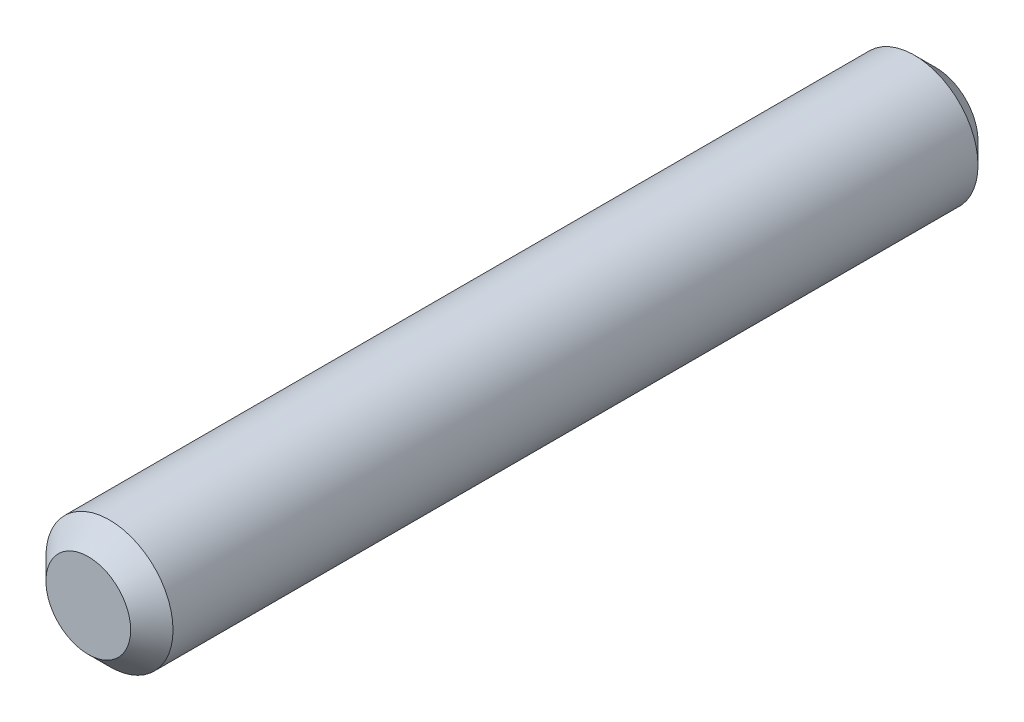
ISO-10303-21;
HEADER;
FILE_DESCRIPTION(('STEP AP214'),'2;1');
FILE_NAME('part.step','',(''),(''),'','','');
FILE_SCHEMA(('AUTOMOTIVE_DESIGN { 1 0 10303 214 1 1 1 1 }'));
ENDSEC;
DATA;
#1=APPLICATION_CONTEXT('core data for automotive mechanical design processes');
#2=APPLICATION_PROTOCOL_DEFINITION('international standard','automotive_design',2000,#1);
#3=PRODUCT_CONTEXT('',#1,'mechanical');
#4=PRODUCT('Part','Part','',(#3));
#5=PRODUCT_RELATED_PRODUCT_CATEGORY('part','',(#4));
#6=PRODUCT_DEFINITION_FORMATION('','',#4);
#7=PRODUCT_DEFINITION_CONTEXT('part definition',#1,'design');
#8=PRODUCT_DEFINITION('design','',#6,#7);
#9=PRODUCT_DEFINITION_SHAPE('','',#8);
#10=(LENGTH_UNIT() NAMED_UNIT(*) SI_UNIT(.MILLI.,.METRE.));
#11=(NAMED_UNIT(*) PLANE_ANGLE_UNIT() SI_UNIT($,.RADIAN.));
#12=(NAMED_UNIT(*) SI_UNIT($,.STERADIAN.) SOLID_ANGLE_UNIT());
#13=UNCERTAINTY_MEASURE_WITH_UNIT(LENGTH_MEASURE(1.E-05),#10,'distance_accuracy_value','');
#14=(GEOMETRIC_REPRESENTATION_CONTEXT(3) GLOBAL_UNCERTAINTY_ASSIGNED_CONTEXT((#13)) GLOBAL_UNIT_ASSIGNED_CONTEXT((#10,
#11,#12)) REPRESENTATION_CONTEXT('',''));
#15=CARTESIAN_POINT('',(0.,0.,0.));
#16=DIRECTION('',(0.,0.,1.));
#17=DIRECTION('',(1.,0.,0.));
#18=AXIS2_PLACEMENT_3D('',#15,#16,#17);
#19=CARTESIAN_POINT('',(0.,0.,10.));
#20=DIRECTION('',(0.,0.,-1.));
#21=DIRECTION('',(-1.,0.,0.));
#22=AXIS2_PLACEMENT_3D('',#19,#20,#21);
#23=CYLINDRICAL_SURFACE('',#22,1.5);
#24=CARTESIAN_POINT('',(0.,0.,-9.5));
#25=DIRECTION('',(0.,0.,1.));
#26=DIRECTION('',(1.,0.,0.));
#27=AXIS2_PLACEMENT_3D('',#24,#25,#26);
#28=CIRCLE('',#27,1.5);
#29=CARTESIAN_POINT('',(1.5,0.,-9.5));
#30=VERTEX_POINT('',#29);
#31=EDGE_CURVE('E43',#30,#30,#28,.T.);
#32=ORIENTED_EDGE('',*,*,#31,.T.);
#33=EDGE_LOOP('',(#32));
#34=FACE_BOUND('',#33,.T.);
#35=CARTESIAN_POINT('',(0.,0.,9.5));
#36=DIRECTION('',(0.,0.,1.));
#37=DIRECTION('',(1.,0.,0.));
#38=AXIS2_PLACEMENT_3D('',#35,#36,#37);
#39=CIRCLE('',#38,1.5);
#40=CARTESIAN_POINT('',(1.5,0.,9.5));
#41=VERTEX_POINT('',#40);
#42=EDGE_CURVE('E47',#41,#41,#39,.F.);
#43=ORIENTED_EDGE('',*,*,#42,.T.);
#44=EDGE_LOOP('',(#43));
#45=FACE_BOUND('',#44,.T.);
#46=ADVANCED_FACE('F32',(#34,#45),#23,.T.);
#47=CARTESIAN_POINT('',(0.,0.,10.));
#48=DIRECTION('',(0.,0.,1.));
#49=DIRECTION('',(1.,0.,0.));
#50=AXIS2_PLACEMENT_3D('',#47,#48,#49);
#51=PLANE('',#50);
#52=CARTESIAN_POINT('',(0.,0.,10.));
#53=DIRECTION('',(0.,0.,1.));
#54=DIRECTION('',(1.,0.,0.));
#55=AXIS2_PLACEMENT_3D('',#52,#53,#54);
#56=CIRCLE('',#55,1.);
#57=CARTESIAN_POINT('',(1.,0.,10.));
#58=VERTEX_POINT('',#57);
#59=EDGE_CURVE('E10',#58,#58,#56,.T.);
#60=ORIENTED_EDGE('',*,*,#59,.T.);
#61=EDGE_LOOP('',(#60));
#62=FACE_BOUND('',#61,.T.);
#63=ADVANCED_FACE('F63',(#62),#51,.T.);
#64=CARTESIAN_POINT('',(0.,0.,-10.));
#65=DIRECTION('',(0.,0.,1.));
#66=DIRECTION('',(1.,0.,0.));
#67=AXIS2_PLACEMENT_3D('',#64,#65,#66);
#68=PLANE('',#67);
#69=CARTESIAN_POINT('',(0.,0.,-10.));
#70=DIRECTION('',(0.,0.,1.));
#71=DIRECTION('',(1.,0.,0.));
#72=AXIS2_PLACEMENT_3D('',#69,#70,#71);
#73=CIRCLE('',#72,0.999999999999997);
#74=CARTESIAN_POINT('',(0.999999999999997,0.,-10.));
#75=VERTEX_POINT('',#74);
#76=EDGE_CURVE('E39',#75,#75,#73,.F.);
#77=ORIENTED_EDGE('',*,*,#76,.T.);
#78=EDGE_LOOP('',(#77));
#79=FACE_BOUND('',#78,.T.);
#80=ADVANCED_FACE('F60',(#79),#68,.F.);
#81=CARTESIAN_POINT('',(0.,0.,-9.5));
#82=DIRECTION('',(0.,0.,1.));
#83=DIRECTION('',(1.,0.,0.));
#84=AXIS2_PLACEMENT_3D('',#81,#82,#83);
#85=CONICAL_SURFACE('',#84,1.5,0.785398163397454);
#86=ORIENTED_EDGE('',*,*,#76,.F.);
#87=EDGE_LOOP('',(#86));
#88=FACE_BOUND('',#87,.T.);
#89=ORIENTED_EDGE('',*,*,#31,.F.);
#90=EDGE_LOOP('',(#89));
#91=FACE_BOUND('',#90,.T.);
#92=ADVANCED_FACE('F56',(#88,#91),#85,.T.);
#93=CARTESIAN_POINT('',(0.,0.,10.));
#94=DIRECTION('',(0.,0.,-1.));
#95=DIRECTION('',(-1.,0.,0.));
#96=AXIS2_PLACEMENT_3D('',#93,#94,#95);
#97=CONICAL_SURFACE('',#96,1.,0.785398163397447);
#98=ORIENTED_EDGE('',*,*,#42,.F.);
#99=EDGE_LOOP('',(#98));
#100=FACE_BOUND('',#99,.T.);
#101=ORIENTED_EDGE('',*,*,#59,.F.);
#102=EDGE_LOOP('',(#101));
#103=FACE_BOUND('',#102,.T.);
#104=ADVANCED_FACE('F34',(#100,#103),#97,.T.);
#105=CLOSED_SHELL('',(#46,#63,#80,#92,#104));
#106=MANIFOLD_SOLID_BREP('B2',#105);
#107=ADVANCED_BREP_SHAPE_REPRESENTATION('',(#18,#106),#14);
#108=SHAPE_DEFINITION_REPRESENTATION(#9,#107);
ENDSEC;
END-ISO-10303-21;
